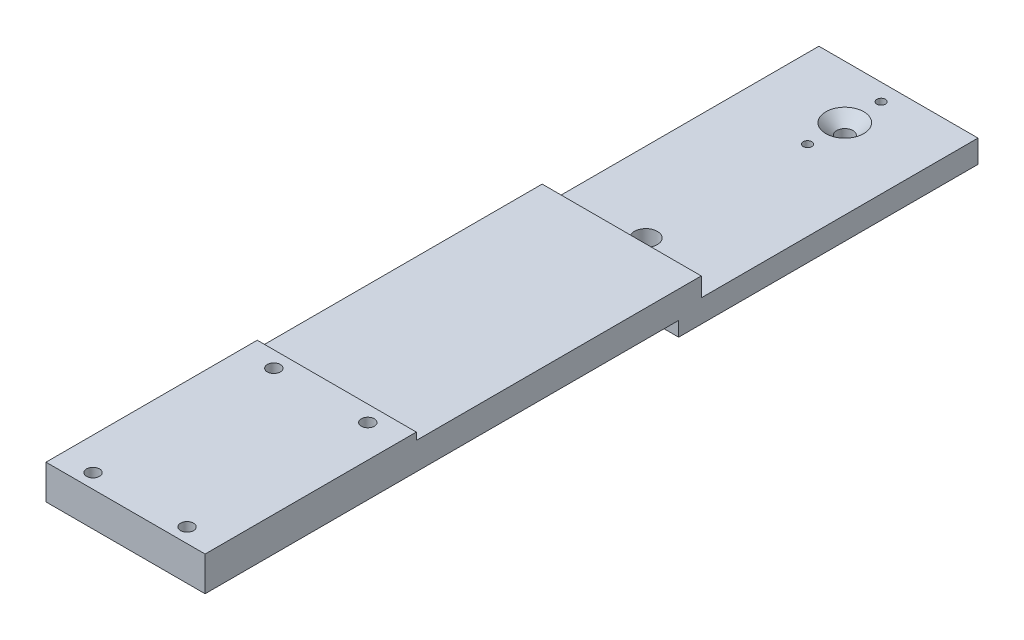
ISO-10303-21;
HEADER;
FILE_DESCRIPTION(('STEP AP214'),'2;1');
FILE_NAME('part.step','',(''),(''),'','','');
FILE_SCHEMA(('AUTOMOTIVE_DESIGN { 1 0 10303 214 1 1 1 1 }'));
ENDSEC;
DATA;
#1=APPLICATION_CONTEXT('core data for automotive mechanical design processes');
#2=APPLICATION_PROTOCOL_DEFINITION('international standard','automotive_design',2000,#1);
#3=PRODUCT_CONTEXT('',#1,'mechanical');
#4=PRODUCT('Part','Part','',(#3));
#5=PRODUCT_RELATED_PRODUCT_CATEGORY('part','',(#4));
#6=PRODUCT_DEFINITION_FORMATION('','',#4);
#7=PRODUCT_DEFINITION_CONTEXT('part definition',#1,'design');
#8=PRODUCT_DEFINITION('design','',#6,#7);
#9=PRODUCT_DEFINITION_SHAPE('','',#8);
#10=(LENGTH_UNIT() NAMED_UNIT(*) SI_UNIT(.MILLI.,.METRE.));
#11=(NAMED_UNIT(*) PLANE_ANGLE_UNIT() SI_UNIT($,.RADIAN.));
#12=(NAMED_UNIT(*) SI_UNIT($,.STERADIAN.) SOLID_ANGLE_UNIT());
#13=UNCERTAINTY_MEASURE_WITH_UNIT(LENGTH_MEASURE(1.E-05),#10,'distance_accuracy_value','');
#14=(GEOMETRIC_REPRESENTATION_CONTEXT(3) GLOBAL_UNCERTAINTY_ASSIGNED_CONTEXT((#13)) GLOBAL_UNIT_ASSIGNED_CONTEXT((#10,
#11,#12)) REPRESENTATION_CONTEXT('',''));
#15=CARTESIAN_POINT('',(0.,0.,0.));
#16=DIRECTION('',(0.,0.,1.));
#17=DIRECTION('',(1.,0.,0.));
#18=AXIS2_PLACEMENT_3D('',#15,#16,#17);
#19=CARTESIAN_POINT('',(-22.,0.,81.473999993));
#20=DIRECTION('',(0.,1.,0.));
#21=DIRECTION('',(0.,0.,1.));
#22=AXIS2_PLACEMENT_3D('',#19,#20,#21);
#23=PLANE('',#22);
#24=CARTESIAN_POINT('',(-13.,0.,77.473999993));
#25=DIRECTION('',(0.,-1.,0.));
#26=DIRECTION('',(0.,0.,-1.));
#27=AXIS2_PLACEMENT_3D('',#24,#25,#26);
#28=CIRCLE('',#27,3.35);
#29=CARTESIAN_POINT('',(-13.,0.,74.123999993));
#30=VERTEX_POINT('',#29);
#31=EDGE_CURVE('E179',#30,#30,#28,.T.);
#32=ORIENTED_EDGE('',*,*,#31,.F.);
#33=EDGE_LOOP('',(#32));
#34=FACE_BOUND('',#33,.T.);
#35=CARTESIAN_POINT('',(13.,0.,77.473999993));
#36=DIRECTION('',(0.,-1.,0.));
#37=DIRECTION('',(0.,0.,-1.));
#38=AXIS2_PLACEMENT_3D('',#35,#36,#37);
#39=CIRCLE('',#38,3.35);
#40=CARTESIAN_POINT('',(13.,0.,74.123999993));
#41=VERTEX_POINT('',#40);
#42=EDGE_CURVE('E440',#41,#41,#39,.T.);
#43=ORIENTED_EDGE('',*,*,#42,.F.);
#44=EDGE_LOOP('',(#43));
#45=FACE_BOUND('',#44,.T.);
#46=DIRECTION('',(-1.,0.,0.));
#47=VECTOR('',#46,1.);
#48=CARTESIAN_POINT('',(-22.,0.,-49.4877369000548));
#49=LINE('',#48,#47);
#50=CARTESIAN_POINT('',(22.,0.,-49.4877369000548));
#51=VERTEX_POINT('',#50);
#52=CARTESIAN_POINT('',(-22.,0.,-49.4877369000548));
#53=VERTEX_POINT('',#52);
#54=EDGE_CURVE('E48',#51,#53,#49,.T.);
#55=ORIENTED_EDGE('',*,*,#54,.F.);
#56=DIRECTION('',(0.,0.,-1.));
#57=VECTOR('',#56,1.);
#58=CARTESIAN_POINT('',(22.,0.,-81.473999993));
#59=LINE('',#58,#57);
#60=CARTESIAN_POINT('',(22.,0.,81.473999993));
#61=VERTEX_POINT('',#60);
#62=EDGE_CURVE('E163',#61,#51,#59,.T.);
#63=ORIENTED_EDGE('',*,*,#62,.F.);
#64=DIRECTION('',(1.,0.,0.));
#65=VECTOR('',#64,1.);
#66=CARTESIAN_POINT('',(-22.,0.,81.473999993));
#67=LINE('',#66,#65);
#68=CARTESIAN_POINT('',(-22.,0.,81.473999993));
#69=VERTEX_POINT('',#68);
#70=EDGE_CURVE('E199',#69,#61,#67,.T.);
#71=ORIENTED_EDGE('',*,*,#70,.F.);
#72=DIRECTION('',(0.,0.,1.));
#73=VECTOR('',#72,1.);
#74=CARTESIAN_POINT('',(-22.,0.,-81.473999993));
#75=LINE('',#74,#73);
#76=EDGE_CURVE('E197',#53,#69,#75,.T.);
#77=ORIENTED_EDGE('',*,*,#76,.F.);
#78=EDGE_LOOP('',(#55,#63,#71,#77));
#79=FACE_BOUND('',#78,.T.);
#80=CARTESIAN_POINT('',(-13.,0.,27.473999993));
#81=DIRECTION('',(0.,-1.,0.));
#82=DIRECTION('',(0.,0.,-1.));
#83=AXIS2_PLACEMENT_3D('',#80,#81,#82);
#84=CIRCLE('',#83,3.35);
#85=CARTESIAN_POINT('',(-13.,0.,24.123999993));
#86=VERTEX_POINT('',#85);
#87=EDGE_CURVE('E464',#86,#86,#84,.T.);
#88=ORIENTED_EDGE('',*,*,#87,.F.);
#89=EDGE_LOOP('',(#88));
#90=FACE_BOUND('',#89,.T.);
#91=CARTESIAN_POINT('',(13.,0.,27.473999993));
#92=DIRECTION('',(0.,-1.,0.));
#93=DIRECTION('',(0.,0.,-1.));
#94=AXIS2_PLACEMENT_3D('',#91,#92,#93);
#95=CIRCLE('',#94,3.35);
#96=CARTESIAN_POINT('',(13.,0.,24.123999993));
#97=VERTEX_POINT('',#96);
#98=EDGE_CURVE('E452',#97,#97,#95,.T.);
#99=ORIENTED_EDGE('',*,*,#98,.F.);
#100=EDGE_LOOP('',(#99));
#101=FACE_BOUND('',#100,.T.);
#102=ADVANCED_FACE('F33',(#34,#45,#79,#90,#101),#23,.F.);
#103=CARTESIAN_POINT('',(-22.,9.525,-81.473999993));
#104=DIRECTION('',(1.,0.,0.));
#105=DIRECTION('',(0.,0.,-1.));
#106=AXIS2_PLACEMENT_3D('',#103,#104,#105);
#107=PLANE('',#106);
#108=DIRECTION('',(0.,0.,1.));
#109=VECTOR('',#108,1.);
#110=CARTESIAN_POINT('',(-22.,7.525,-81.473999993));
#111=LINE('',#110,#109);
#112=CARTESIAN_POINT('',(-22.,7.525,-55.7388053269534));
#113=VERTEX_POINT('',#112);
#114=CARTESIAN_POINT('',(-22.,7.525,23.053999993));
#115=VERTEX_POINT('',#114);
#116=EDGE_CURVE('E224',#113,#115,#111,.T.);
#117=ORIENTED_EDGE('',*,*,#116,.F.);
#118=DIRECTION('',(0.,1.,0.));
#119=VECTOR('',#118,1.);
#120=CARTESIAN_POINT('',(-22.,2.275,-55.7388053269534));
#121=LINE('',#120,#119);
#122=CARTESIAN_POINT('',(-22.,2.275,-55.7388053269534));
#123=VERTEX_POINT('',#122);
#124=EDGE_CURVE('E56',#123,#113,#121,.T.);
#125=ORIENTED_EDGE('',*,*,#124,.F.);
#126=DIRECTION('',(0.,0.,1.));
#127=VECTOR('',#126,1.);
#128=CARTESIAN_POINT('',(-22.,2.275,-81.473999993));
#129=LINE('',#128,#127);
#130=CARTESIAN_POINT('',(-22.,2.275,-132.273999993));
#131=VERTEX_POINT('',#130);
#132=EDGE_CURVE('E111',#131,#123,#129,.T.);
#133=ORIENTED_EDGE('',*,*,#132,.F.);
#134=DIRECTION('',(0.,1.,0.));
#135=VECTOR('',#134,1.);
#136=CARTESIAN_POINT('',(-22.,2.275,-132.273999993));
#137=LINE('',#136,#135);
#138=CARTESIAN_POINT('',(-22.,-4.032,-132.273999993));
#139=VERTEX_POINT('',#138);
#140=EDGE_CURVE('E117',#139,#131,#137,.T.);
#141=ORIENTED_EDGE('',*,*,#140,.F.);
#142=DIRECTION('',(0.,0.,-1.));
#143=VECTOR('',#142,1.);
#144=CARTESIAN_POINT('',(-22.,-4.032,-81.473999993));
#145=LINE('',#144,#143);
#146=CARTESIAN_POINT('',(-22.,-4.032,-49.4877369000548));
#147=VERTEX_POINT('',#146);
#148=EDGE_CURVE('E151',#147,#139,#145,.T.);
#149=ORIENTED_EDGE('',*,*,#148,.F.);
#150=DIRECTION('',(0.,1.,0.));
#151=VECTOR('',#150,1.);
#152=CARTESIAN_POINT('',(-22.,-4.032,-49.4877369000548));
#153=LINE('',#152,#151);
#154=EDGE_CURVE('E157',#147,#53,#153,.T.);
#155=ORIENTED_EDGE('',*,*,#154,.T.);
#156=ORIENTED_EDGE('',*,*,#76,.T.);
#157=DIRECTION('',(0.,-1.,0.));
#158=VECTOR('',#157,1.);
#159=CARTESIAN_POINT('',(-22.,9.525,81.473999993));
#160=LINE('',#159,#158);
#161=CARTESIAN_POINT('',(-22.,9.525,81.473999993));
#162=VERTEX_POINT('',#161);
#163=EDGE_CURVE('E185',#162,#69,#160,.T.);
#164=ORIENTED_EDGE('',*,*,#163,.F.);
#165=DIRECTION('',(0.,0.,1.));
#166=VECTOR('',#165,1.);
#167=CARTESIAN_POINT('',(-22.,9.525,-81.473999993));
#168=LINE('',#167,#166);
#169=CARTESIAN_POINT('',(-22.,9.525,23.053999993));
#170=VERTEX_POINT('',#169);
#171=EDGE_CURVE('E208',#170,#162,#168,.T.);
#172=ORIENTED_EDGE('',*,*,#171,.F.);
#173=DIRECTION('',(0.,1.,0.));
#174=VECTOR('',#173,1.);
#175=CARTESIAN_POINT('',(-22.,7.525,23.053999993));
#176=LINE('',#175,#174);
#177=EDGE_CURVE('E217',#115,#170,#176,.T.);
#178=ORIENTED_EDGE('',*,*,#177,.F.);
#179=EDGE_LOOP('',(#117,#125,#133,#141,#149,#155,#156,#164,#172,#178));
#180=FACE_BOUND('',#179,.T.);
#181=ADVANCED_FACE('F114',(#180),#107,.F.);
#182=CARTESIAN_POINT('',(-22.,9.525,81.473999993));
#183=DIRECTION('',(0.,0.,-1.));
#184=DIRECTION('',(-1.,0.,0.));
#185=AXIS2_PLACEMENT_3D('',#182,#183,#184);
#186=PLANE('',#185);
#187=ORIENTED_EDGE('',*,*,#70,.T.);
#188=DIRECTION('',(0.,-1.,0.));
#189=VECTOR('',#188,1.);
#190=CARTESIAN_POINT('',(22.,9.525,81.473999993));
#191=LINE('',#190,#189);
#192=CARTESIAN_POINT('',(22.,9.525,81.473999993));
#193=VERTEX_POINT('',#192);
#194=EDGE_CURVE('E189',#193,#61,#191,.T.);
#195=ORIENTED_EDGE('',*,*,#194,.F.);
#196=DIRECTION('',(1.,0.,0.));
#197=VECTOR('',#196,1.);
#198=CARTESIAN_POINT('',(-22.,9.525,81.473999993));
#199=LINE('',#198,#197);
#200=EDGE_CURVE('E211',#162,#193,#199,.T.);
#201=ORIENTED_EDGE('',*,*,#200,.F.);
#202=ORIENTED_EDGE('',*,*,#163,.T.);
#203=EDGE_LOOP('',(#187,#195,#201,#202));
#204=FACE_BOUND('',#203,.T.);
#205=ADVANCED_FACE('F262',(#204),#186,.F.);
#206=CARTESIAN_POINT('',(22.,9.525,-81.473999993));
#207=DIRECTION('',(-1.,0.,0.));
#208=DIRECTION('',(0.,0.,1.));
#209=AXIS2_PLACEMENT_3D('',#206,#207,#208);
#210=PLANE('',#209);
#211=DIRECTION('',(0.,0.,-1.));
#212=VECTOR('',#211,1.);
#213=CARTESIAN_POINT('',(22.,2.275,-81.473999993));
#214=LINE('',#213,#212);
#215=CARTESIAN_POINT('',(22.,2.275,-55.7388053269534));
#216=VERTEX_POINT('',#215);
#217=CARTESIAN_POINT('',(22.,2.275,-132.273999993));
#218=VERTEX_POINT('',#217);
#219=EDGE_CURVE('E121',#216,#218,#214,.T.);
#220=ORIENTED_EDGE('',*,*,#219,.F.);
#221=DIRECTION('',(0.,1.,0.));
#222=VECTOR('',#221,1.);
#223=CARTESIAN_POINT('',(22.,2.275,-55.7388053269534));
#224=LINE('',#223,#222);
#225=CARTESIAN_POINT('',(22.,7.525,-55.7388053269534));
#226=VERTEX_POINT('',#225);
#227=EDGE_CURVE('E225',#216,#226,#224,.T.);
#228=ORIENTED_EDGE('',*,*,#227,.T.);
#229=DIRECTION('',(0.,0.,-1.));
#230=VECTOR('',#229,1.);
#231=CARTESIAN_POINT('',(22.,7.525,-81.473999993));
#232=LINE('',#231,#230);
#233=CARTESIAN_POINT('',(22.,7.525,23.053999993));
#234=VERTEX_POINT('',#233);
#235=EDGE_CURVE('E219',#234,#226,#232,.T.);
#236=ORIENTED_EDGE('',*,*,#235,.F.);
#237=DIRECTION('',(0.,1.,0.));
#238=VECTOR('',#237,1.);
#239=CARTESIAN_POINT('',(22.,7.525,23.053999993));
#240=LINE('',#239,#238);
#241=CARTESIAN_POINT('',(22.,9.525,23.053999993));
#242=VERTEX_POINT('',#241);
#243=EDGE_CURVE('E200',#234,#242,#240,.T.);
#244=ORIENTED_EDGE('',*,*,#243,.T.);
#245=DIRECTION('',(0.,0.,-1.));
#246=VECTOR('',#245,1.);
#247=CARTESIAN_POINT('',(22.,9.525,-81.473999993));
#248=LINE('',#247,#246);
#249=EDGE_CURVE('E195',#193,#242,#248,.T.);
#250=ORIENTED_EDGE('',*,*,#249,.F.);
#251=ORIENTED_EDGE('',*,*,#194,.T.);
#252=ORIENTED_EDGE('',*,*,#62,.T.);
#253=DIRECTION('',(0.,1.,0.));
#254=VECTOR('',#253,1.);
#255=CARTESIAN_POINT('',(22.,-4.032,-49.4877369000548));
#256=LINE('',#255,#254);
#257=CARTESIAN_POINT('',(22.,-4.032,-49.4877369000548));
#258=VERTEX_POINT('',#257);
#259=EDGE_CURVE('E168',#258,#51,#256,.T.);
#260=ORIENTED_EDGE('',*,*,#259,.F.);
#261=DIRECTION('',(0.,0.,1.));
#262=VECTOR('',#261,1.);
#263=CARTESIAN_POINT('',(22.,-4.032,-81.473999993));
#264=LINE('',#263,#262);
#265=CARTESIAN_POINT('',(22.,-4.032,-132.273999993));
#266=VERTEX_POINT('',#265);
#267=EDGE_CURVE('E153',#266,#258,#264,.T.);
#268=ORIENTED_EDGE('',*,*,#267,.F.);
#269=DIRECTION('',(0.,-1.,0.));
#270=VECTOR('',#269,1.);
#271=CARTESIAN_POINT('',(22.,2.275,-132.273999993));
#272=LINE('',#271,#270);
#273=EDGE_CURVE('E130',#218,#266,#272,.T.);
#274=ORIENTED_EDGE('',*,*,#273,.F.);
#275=EDGE_LOOP('',(#220,#228,#236,#244,#250,#251,#252,#260,#268,#274));
#276=FACE_BOUND('',#275,.T.);
#277=ADVANCED_FACE('F236',(#276),#210,.F.);
#278=CARTESIAN_POINT('',(-22.,9.525,81.473999993));
#279=DIRECTION('',(0.,1.,0.));
#280=DIRECTION('',(0.,0.,1.));
#281=AXIS2_PLACEMENT_3D('',#278,#279,#280);
#282=PLANE('',#281);
#283=CARTESIAN_POINT('',(-13.,9.525,77.473999993));
#284=DIRECTION('',(0.,-1.,0.));
#285=DIRECTION('',(0.,0.,-1.));
#286=AXIS2_PLACEMENT_3D('',#283,#284,#285);
#287=CIRCLE('',#286,1.8);
#288=CARTESIAN_POINT('',(-13.,9.525,75.6739999930001));
#289=VERTEX_POINT('',#288);
#290=EDGE_CURVE('E437',#289,#289,#287,.T.);
#291=ORIENTED_EDGE('',*,*,#290,.T.);
#292=EDGE_LOOP('',(#291));
#293=FACE_BOUND('',#292,.T.);
#294=CARTESIAN_POINT('',(13.,9.525,77.473999993));
#295=DIRECTION('',(0.,-1.,0.));
#296=DIRECTION('',(0.,0.,-1.));
#297=AXIS2_PLACEMENT_3D('',#294,#295,#296);
#298=CIRCLE('',#297,1.8);
#299=CARTESIAN_POINT('',(13.,9.525,75.673999993));
#300=VERTEX_POINT('',#299);
#301=EDGE_CURVE('E449',#300,#300,#298,.T.);
#302=ORIENTED_EDGE('',*,*,#301,.T.);
#303=EDGE_LOOP('',(#302));
#304=FACE_BOUND('',#303,.T.);
#305=CARTESIAN_POINT('',(13.,9.525,27.473999993));
#306=DIRECTION('',(0.,-1.,0.));
#307=DIRECTION('',(0.,0.,-1.));
#308=AXIS2_PLACEMENT_3D('',#305,#306,#307);
#309=CIRCLE('',#308,1.8);
#310=CARTESIAN_POINT('',(13.,9.525,25.673999993));
#311=VERTEX_POINT('',#310);
#312=EDGE_CURVE('E461',#311,#311,#309,.T.);
#313=ORIENTED_EDGE('',*,*,#312,.T.);
#314=EDGE_LOOP('',(#313));
#315=FACE_BOUND('',#314,.T.);
#316=CARTESIAN_POINT('',(-13.,9.525,27.473999993));
#317=DIRECTION('',(0.,-1.,0.));
#318=DIRECTION('',(0.,0.,-1.));
#319=AXIS2_PLACEMENT_3D('',#316,#317,#318);
#320=CIRCLE('',#319,1.8);
#321=CARTESIAN_POINT('',(-13.,9.525,25.673999993));
#322=VERTEX_POINT('',#321);
#323=EDGE_CURVE('E136',#322,#322,#320,.T.);
#324=ORIENTED_EDGE('',*,*,#323,.T.);
#325=EDGE_LOOP('',(#324));
#326=FACE_BOUND('',#325,.T.);
#327=DIRECTION('',(1.,0.,0.));
#328=VECTOR('',#327,1.);
#329=CARTESIAN_POINT('',(-22.,9.525,23.053999993));
#330=LINE('',#329,#328);
#331=EDGE_CURVE('E222',#170,#242,#330,.T.);
#332=ORIENTED_EDGE('',*,*,#331,.F.);
#333=ORIENTED_EDGE('',*,*,#171,.T.);
#334=ORIENTED_EDGE('',*,*,#200,.T.);
#335=ORIENTED_EDGE('',*,*,#249,.T.);
#336=EDGE_LOOP('',(#332,#333,#334,#335));
#337=FACE_BOUND('',#336,.T.);
#338=ADVANCED_FACE('F267',(#293,#304,#315,#326,#337),#282,.T.);
#339=CARTESIAN_POINT('',(-22.,7.525,23.053999993));
#340=DIRECTION('',(0.,0.,1.));
#341=DIRECTION('',(1.,0.,0.));
#342=AXIS2_PLACEMENT_3D('',#339,#340,#341);
#343=PLANE('',#342);
#344=ORIENTED_EDGE('',*,*,#331,.T.);
#345=ORIENTED_EDGE('',*,*,#243,.F.);
#346=DIRECTION('',(1.,0.,0.));
#347=VECTOR('',#346,1.);
#348=CARTESIAN_POINT('',(-22.,7.525,23.053999993));
#349=LINE('',#348,#347);
#350=EDGE_CURVE('E228',#115,#234,#349,.T.);
#351=ORIENTED_EDGE('',*,*,#350,.F.);
#352=ORIENTED_EDGE('',*,*,#177,.T.);
#353=EDGE_LOOP('',(#344,#345,#351,#352));
#354=FACE_BOUND('',#353,.T.);
#355=ADVANCED_FACE('F288',(#354),#343,.F.);
#356=CARTESIAN_POINT('',(-22.,7.525,23.053999993));
#357=DIRECTION('',(0.,1.,0.));
#358=DIRECTION('',(0.,0.,1.));
#359=AXIS2_PLACEMENT_3D('',#356,#357,#358);
#360=PLANE('',#359);
#361=DIRECTION('',(1.,0.,0.));
#362=VECTOR('',#361,1.);
#363=CARTESIAN_POINT('',(22.,7.525,-55.7388053269534));
#364=LINE('',#363,#362);
#365=EDGE_CURVE('E173',#113,#226,#364,.T.);
#366=ORIENTED_EDGE('',*,*,#365,.F.);
#367=ORIENTED_EDGE('',*,*,#116,.T.);
#368=ORIENTED_EDGE('',*,*,#350,.T.);
#369=ORIENTED_EDGE('',*,*,#235,.T.);
#370=EDGE_LOOP('',(#366,#367,#368,#369));
#371=FACE_BOUND('',#370,.T.);
#372=ADVANCED_FACE('F295',(#371),#360,.T.);
#373=CARTESIAN_POINT('',(22.,2.275,-55.7388053269534));
#374=DIRECTION('',(0.,0.,1.));
#375=DIRECTION('',(1.,0.,0.));
#376=AXIS2_PLACEMENT_3D('',#373,#374,#375);
#377=PLANE('',#376);
#378=ORIENTED_EDGE('',*,*,#365,.T.);
#379=ORIENTED_EDGE('',*,*,#227,.F.);
#380=DIRECTION('',(1.,0.,0.));
#381=VECTOR('',#380,1.);
#382=CARTESIAN_POINT('',(22.,2.275,-55.7388053269534));
#383=LINE('',#382,#381);
#384=EDGE_CURVE('E120',#123,#216,#383,.T.);
#385=ORIENTED_EDGE('',*,*,#384,.F.);
#386=ORIENTED_EDGE('',*,*,#124,.T.);
#387=EDGE_LOOP('',(#378,#379,#385,#386));
#388=FACE_BOUND('',#387,.T.);
#389=ADVANCED_FACE('F253',(#388),#377,.F.);
#390=CARTESIAN_POINT('',(22.,2.275,-55.7388053269534));
#391=DIRECTION('',(0.,-1.,0.));
#392=DIRECTION('',(0.,0.,-1.));
#393=AXIS2_PLACEMENT_3D('',#390,#391,#392);
#394=PLANE('',#393);
#395=CARTESIAN_POINT('',(-0.100070519600967,2.275,-117.540271761604));
#396=DIRECTION('',(0.,-1.,0.));
#397=DIRECTION('',(0.,0.,-1.));
#398=AXIS2_PLACEMENT_3D('',#395,#396,#397);
#399=CIRCLE('',#398,5.24999999999995);
#400=CARTESIAN_POINT('',(-0.100070519600967,2.275,-122.790271761604));
#401=VERTEX_POINT('',#400);
#402=EDGE_CURVE('E11',#401,#401,#399,.T.);
#403=ORIENTED_EDGE('',*,*,#402,.T.);
#404=EDGE_LOOP('',(#403));
#405=FACE_BOUND('',#404,.T.);
#406=CARTESIAN_POINT('',(-0.100070519600975,2.275,-107.254998873011));
#407=DIRECTION('',(0.,1.,0.));
#408=DIRECTION('',(0.,0.,1.));
#409=AXIS2_PLACEMENT_3D('',#406,#407,#408);
#410=CIRCLE('',#409,1.190625);
#411=CARTESIAN_POINT('',(-0.100070519600975,2.275,-106.064373873011));
#412=VERTEX_POINT('',#411);
#413=EDGE_CURVE('E183',#412,#412,#410,.T.);
#414=ORIENTED_EDGE('',*,*,#413,.F.);
#415=EDGE_LOOP('',(#414));
#416=FACE_BOUND('',#415,.T.);
#417=CARTESIAN_POINT('',(-0.100070519600968,2.275,-127.574998873011));
#418=DIRECTION('',(0.,1.,0.));
#419=DIRECTION('',(0.,0.,1.));
#420=AXIS2_PLACEMENT_3D('',#417,#418,#419);
#421=CIRCLE('',#420,1.19062500000001);
#422=CARTESIAN_POINT('',(-0.100070519600968,2.275,-126.384373873011));
#423=VERTEX_POINT('',#422);
#424=EDGE_CURVE('E180',#423,#423,#421,.T.);
#425=ORIENTED_EDGE('',*,*,#424,.F.);
#426=EDGE_LOOP('',(#425));
#427=FACE_BOUND('',#426,.T.);
#428=CARTESIAN_POINT('',(0.,2.275,-62.4240000070001));
#429=DIRECTION('',(0.,-1.,0.));
#430=DIRECTION('',(0.,0.,-1.));
#431=AXIS2_PLACEMENT_3D('',#428,#429,#430);
#432=CIRCLE('',#431,3.175);
#433=CARTESIAN_POINT('',(0.,2.275,-65.5990000070001));
#434=VERTEX_POINT('',#433);
#435=EDGE_CURVE('E148',#434,#434,#432,.T.);
#436=ORIENTED_EDGE('',*,*,#435,.T.);
#437=EDGE_LOOP('',(#436));
#438=FACE_BOUND('',#437,.T.);
#439=ORIENTED_EDGE('',*,*,#219,.T.);
#440=DIRECTION('',(1.,0.,0.));
#441=VECTOR('',#440,1.);
#442=CARTESIAN_POINT('',(-22.,2.275,-132.273999993));
#443=LINE('',#442,#441);
#444=EDGE_CURVE('E124',#131,#218,#443,.T.);
#445=ORIENTED_EDGE('',*,*,#444,.F.);
#446=ORIENTED_EDGE('',*,*,#132,.T.);
#447=ORIENTED_EDGE('',*,*,#384,.T.);
#448=EDGE_LOOP('',(#439,#445,#446,#447));
#449=FACE_BOUND('',#448,.T.);
#450=ADVANCED_FACE('F125',(#405,#416,#427,#438,#449),#394,.F.);
#451=CARTESIAN_POINT('',(-22.,-4.032,-49.4877369000548));
#452=DIRECTION('',(0.,0.,-1.));
#453=DIRECTION('',(-1.,0.,0.));
#454=AXIS2_PLACEMENT_3D('',#451,#452,#453);
#455=PLANE('',#454);
#456=ORIENTED_EDGE('',*,*,#54,.T.);
#457=ORIENTED_EDGE('',*,*,#154,.F.);
#458=DIRECTION('',(-1.,0.,0.));
#459=VECTOR('',#458,1.);
#460=CARTESIAN_POINT('',(-22.,-4.032,-49.4877369000548));
#461=LINE('',#460,#459);
#462=EDGE_CURVE('E155',#258,#147,#461,.T.);
#463=ORIENTED_EDGE('',*,*,#462,.F.);
#464=ORIENTED_EDGE('',*,*,#259,.T.);
#465=EDGE_LOOP('',(#456,#457,#463,#464));
#466=FACE_BOUND('',#465,.T.);
#467=ADVANCED_FACE('F243',(#466),#455,.F.);
#468=CARTESIAN_POINT('',(-22.,-4.032,-49.4877369000548));
#469=DIRECTION('',(0.,1.,0.));
#470=DIRECTION('',(0.,0.,1.));
#471=AXIS2_PLACEMENT_3D('',#468,#469,#470);
#472=PLANE('',#471);
#473=CARTESIAN_POINT('',(-0.100070519600967,-4.032,-117.540271761604));
#474=DIRECTION('',(0.,1.,0.));
#475=DIRECTION('',(0.,0.,1.));
#476=AXIS2_PLACEMENT_3D('',#473,#474,#475);
#477=CIRCLE('',#476,2.24999999999999);
#478=CARTESIAN_POINT('',(-0.100070519600967,-4.032,-115.290271761604));
#479=VERTEX_POINT('',#478);
#480=EDGE_CURVE('E423',#479,#479,#477,.T.);
#481=ORIENTED_EDGE('',*,*,#480,.T.);
#482=EDGE_LOOP('',(#481));
#483=FACE_BOUND('',#482,.T.);
#484=CARTESIAN_POINT('',(-0.100070519600975,-4.032,-107.254998873011));
#485=DIRECTION('',(0.,1.,0.));
#486=DIRECTION('',(0.,0.,1.));
#487=AXIS2_PLACEMENT_3D('',#484,#485,#486);
#488=CIRCLE('',#487,1.190625);
#489=CARTESIAN_POINT('',(-0.100070519600975,-4.032,-106.064373873011));
#490=VERTEX_POINT('',#489);
#491=EDGE_CURVE('E181',#490,#490,#488,.T.);
#492=ORIENTED_EDGE('',*,*,#491,.T.);
#493=EDGE_LOOP('',(#492));
#494=FACE_BOUND('',#493,.T.);
#495=CARTESIAN_POINT('',(-0.100070519600968,-4.032,-127.574998873011));
#496=DIRECTION('',(0.,1.,0.));
#497=DIRECTION('',(0.,0.,1.));
#498=AXIS2_PLACEMENT_3D('',#495,#496,#497);
#499=CIRCLE('',#498,1.19062500000001);
#500=CARTESIAN_POINT('',(-0.100070519600968,-4.032,-126.384373873011));
#501=VERTEX_POINT('',#500);
#502=EDGE_CURVE('E176',#501,#501,#499,.T.);
#503=ORIENTED_EDGE('',*,*,#502,.T.);
#504=EDGE_LOOP('',(#503));
#505=FACE_BOUND('',#504,.T.);
#506=CARTESIAN_POINT('',(0.,-4.032,-62.4240000070001));
#507=DIRECTION('',(0.,-1.,0.));
#508=DIRECTION('',(0.,0.,-1.));
#509=AXIS2_PLACEMENT_3D('',#506,#507,#508);
#510=CIRCLE('',#509,3.175);
#511=CARTESIAN_POINT('',(0.,-4.032,-65.5990000070001));
#512=VERTEX_POINT('',#511);
#513=EDGE_CURVE('E145',#512,#512,#510,.T.);
#514=ORIENTED_EDGE('',*,*,#513,.F.);
#515=EDGE_LOOP('',(#514));
#516=FACE_BOUND('',#515,.T.);
#517=ORIENTED_EDGE('',*,*,#148,.T.);
#518=DIRECTION('',(-1.,0.,0.));
#519=VECTOR('',#518,1.);
#520=CARTESIAN_POINT('',(-22.,-4.032,-132.273999993));
#521=LINE('',#520,#519);
#522=EDGE_CURVE('E135',#266,#139,#521,.T.);
#523=ORIENTED_EDGE('',*,*,#522,.F.);
#524=ORIENTED_EDGE('',*,*,#267,.T.);
#525=ORIENTED_EDGE('',*,*,#462,.T.);
#526=EDGE_LOOP('',(#517,#523,#524,#525));
#527=FACE_BOUND('',#526,.T.);
#528=ADVANCED_FACE('F239',(#483,#494,#505,#516,#527),#472,.F.);
#529=CARTESIAN_POINT('',(0.,-4.032,-62.4240000070001));
#530=DIRECTION('',(0.,-1.,0.));
#531=DIRECTION('',(0.,0.,-1.));
#532=AXIS2_PLACEMENT_3D('',#529,#530,#531);
#533=CYLINDRICAL_SURFACE('',#532,3.175);
#534=ORIENTED_EDGE('',*,*,#513,.T.);
#535=EDGE_LOOP('',(#534));
#536=FACE_BOUND('',#535,.T.);
#537=ORIENTED_EDGE('',*,*,#435,.F.);
#538=EDGE_LOOP('',(#537));
#539=FACE_BOUND('',#538,.T.);
#540=ADVANCED_FACE('F250',(#536,#539),#533,.F.);
#541=CARTESIAN_POINT('',(-22.,-4.032,-132.273999993));
#542=DIRECTION('',(0.,0.,1.));
#543=DIRECTION('',(1.,0.,0.));
#544=AXIS2_PLACEMENT_3D('',#541,#542,#543);
#545=PLANE('',#544);
#546=ORIENTED_EDGE('',*,*,#140,.T.);
#547=ORIENTED_EDGE('',*,*,#444,.T.);
#548=ORIENTED_EDGE('',*,*,#273,.T.);
#549=ORIENTED_EDGE('',*,*,#522,.T.);
#550=EDGE_LOOP('',(#546,#547,#548,#549));
#551=FACE_BOUND('',#550,.T.);
#552=ADVANCED_FACE('F133',(#551),#545,.F.);
#553=CARTESIAN_POINT('',(-13.,0.,27.473999993));
#554=DIRECTION('',(0.,-1.,0.));
#555=DIRECTION('',(0.,0.,-1.));
#556=AXIS2_PLACEMENT_3D('',#553,#554,#555);
#557=CYLINDRICAL_SURFACE('',#556,1.8);
#558=ORIENTED_EDGE('',*,*,#323,.F.);
#559=EDGE_LOOP('',(#558));
#560=FACE_BOUND('',#559,.T.);
#561=CARTESIAN_POINT('',(-13.,1.65,27.473999993));
#562=DIRECTION('',(0.,-1.,0.));
#563=DIRECTION('',(0.,0.,-1.));
#564=AXIS2_PLACEMENT_3D('',#561,#562,#563);
#565=CIRCLE('',#564,1.8);
#566=CARTESIAN_POINT('',(-13.,1.65,25.673999993));
#567=VERTEX_POINT('',#566);
#568=EDGE_CURVE('E139',#567,#567,#565,.T.);
#569=ORIENTED_EDGE('',*,*,#568,.T.);
#570=EDGE_LOOP('',(#569));
#571=FACE_BOUND('',#570,.T.);
#572=ADVANCED_FACE('F359',(#560,#571),#557,.F.);
#573=CARTESIAN_POINT('',(-11.2,1.65,27.473999993));
#574=DIRECTION('',(0.,1.,0.));
#575=DIRECTION('',(0.,0.,1.));
#576=AXIS2_PLACEMENT_3D('',#573,#574,#575);
#577=PLANE('',#576);
#578=ORIENTED_EDGE('',*,*,#568,.F.);
#579=EDGE_LOOP('',(#578));
#580=FACE_BOUND('',#579,.T.);
#581=CARTESIAN_POINT('',(-13.,1.65,27.473999993));
#582=DIRECTION('',(0.,-1.,0.));
#583=DIRECTION('',(0.,0.,-1.));
#584=AXIS2_PLACEMENT_3D('',#581,#582,#583);
#585=CIRCLE('',#584,3.35);
#586=CARTESIAN_POINT('',(-13.,1.65,24.123999993));
#587=VERTEX_POINT('',#586);
#588=EDGE_CURVE('E467',#587,#587,#585,.T.);
#589=ORIENTED_EDGE('',*,*,#588,.T.);
#590=EDGE_LOOP('',(#589));
#591=FACE_BOUND('',#590,.T.);
#592=ADVANCED_FACE('F364',(#580,#591),#577,.F.);
#593=CARTESIAN_POINT('',(-13.,0.,27.473999993));
#594=DIRECTION('',(0.,-1.,0.));
#595=DIRECTION('',(0.,0.,-1.));
#596=AXIS2_PLACEMENT_3D('',#593,#594,#595);
#597=CYLINDRICAL_SURFACE('',#596,3.35);
#598=ORIENTED_EDGE('',*,*,#588,.F.);
#599=EDGE_LOOP('',(#598));
#600=FACE_BOUND('',#599,.T.);
#601=ORIENTED_EDGE('',*,*,#87,.T.);
#602=EDGE_LOOP('',(#601));
#603=FACE_BOUND('',#602,.T.);
#604=ADVANCED_FACE('F368',(#600,#603),#597,.F.);
#605=CARTESIAN_POINT('',(13.,0.,27.473999993));
#606=DIRECTION('',(0.,-1.,0.));
#607=DIRECTION('',(0.,0.,-1.));
#608=AXIS2_PLACEMENT_3D('',#605,#606,#607);
#609=CYLINDRICAL_SURFACE('',#608,1.8);
#610=ORIENTED_EDGE('',*,*,#312,.F.);
#611=EDGE_LOOP('',(#610));
#612=FACE_BOUND('',#611,.T.);
#613=CARTESIAN_POINT('',(13.,1.65,27.473999993));
#614=DIRECTION('',(0.,-1.,0.));
#615=DIRECTION('',(0.,0.,-1.));
#616=AXIS2_PLACEMENT_3D('',#613,#614,#615);
#617=CIRCLE('',#616,1.8);
#618=CARTESIAN_POINT('',(13.,1.65,25.673999993));
#619=VERTEX_POINT('',#618);
#620=EDGE_CURVE('E458',#619,#619,#617,.T.);
#621=ORIENTED_EDGE('',*,*,#620,.T.);
#622=EDGE_LOOP('',(#621));
#623=FACE_BOUND('',#622,.T.);
#624=ADVANCED_FACE('F372',(#612,#623),#609,.F.);
#625=CARTESIAN_POINT('',(14.8,1.65,27.473999993));
#626=DIRECTION('',(0.,1.,0.));
#627=DIRECTION('',(0.,0.,1.));
#628=AXIS2_PLACEMENT_3D('',#625,#626,#627);
#629=PLANE('',#628);
#630=ORIENTED_EDGE('',*,*,#620,.F.);
#631=EDGE_LOOP('',(#630));
#632=FACE_BOUND('',#631,.T.);
#633=CARTESIAN_POINT('',(13.,1.65,27.473999993));
#634=DIRECTION('',(0.,-1.,0.));
#635=DIRECTION('',(0.,0.,-1.));
#636=AXIS2_PLACEMENT_3D('',#633,#634,#635);
#637=CIRCLE('',#636,3.35);
#638=CARTESIAN_POINT('',(13.,1.65,24.123999993));
#639=VERTEX_POINT('',#638);
#640=EDGE_CURVE('E455',#639,#639,#637,.T.);
#641=ORIENTED_EDGE('',*,*,#640,.T.);
#642=EDGE_LOOP('',(#641));
#643=FACE_BOUND('',#642,.T.);
#644=ADVANCED_FACE('F376',(#632,#643),#629,.F.);
#645=CARTESIAN_POINT('',(13.,0.,27.473999993));
#646=DIRECTION('',(0.,-1.,0.));
#647=DIRECTION('',(0.,0.,-1.));
#648=AXIS2_PLACEMENT_3D('',#645,#646,#647);
#649=CYLINDRICAL_SURFACE('',#648,3.35);
#650=ORIENTED_EDGE('',*,*,#640,.F.);
#651=EDGE_LOOP('',(#650));
#652=FACE_BOUND('',#651,.T.);
#653=ORIENTED_EDGE('',*,*,#98,.T.);
#654=EDGE_LOOP('',(#653));
#655=FACE_BOUND('',#654,.T.);
#656=ADVANCED_FACE('F380',(#652,#655),#649,.F.);
#657=CARTESIAN_POINT('',(13.,0.,77.473999993));
#658=DIRECTION('',(0.,-1.,0.));
#659=DIRECTION('',(0.,0.,-1.));
#660=AXIS2_PLACEMENT_3D('',#657,#658,#659);
#661=CYLINDRICAL_SURFACE('',#660,1.8);
#662=ORIENTED_EDGE('',*,*,#301,.F.);
#663=EDGE_LOOP('',(#662));
#664=FACE_BOUND('',#663,.T.);
#665=CARTESIAN_POINT('',(13.,1.65,77.473999993));
#666=DIRECTION('',(0.,-1.,0.));
#667=DIRECTION('',(0.,0.,-1.));
#668=AXIS2_PLACEMENT_3D('',#665,#666,#667);
#669=CIRCLE('',#668,1.8);
#670=CARTESIAN_POINT('',(13.,1.65,75.673999993));
#671=VERTEX_POINT('',#670);
#672=EDGE_CURVE('E446',#671,#671,#669,.T.);
#673=ORIENTED_EDGE('',*,*,#672,.T.);
#674=EDGE_LOOP('',(#673));
#675=FACE_BOUND('',#674,.T.);
#676=ADVANCED_FACE('F384',(#664,#675),#661,.F.);
#677=CARTESIAN_POINT('',(14.8,1.65,77.473999993));
#678=DIRECTION('',(0.,1.,0.));
#679=DIRECTION('',(0.,0.,1.));
#680=AXIS2_PLACEMENT_3D('',#677,#678,#679);
#681=PLANE('',#680);
#682=ORIENTED_EDGE('',*,*,#672,.F.);
#683=EDGE_LOOP('',(#682));
#684=FACE_BOUND('',#683,.T.);
#685=CARTESIAN_POINT('',(13.,1.65,77.473999993));
#686=DIRECTION('',(0.,-1.,0.));
#687=DIRECTION('',(0.,0.,-1.));
#688=AXIS2_PLACEMENT_3D('',#685,#686,#687);
#689=CIRCLE('',#688,3.35);
#690=CARTESIAN_POINT('',(13.,1.65,74.123999993));
#691=VERTEX_POINT('',#690);
#692=EDGE_CURVE('E443',#691,#691,#689,.T.);
#693=ORIENTED_EDGE('',*,*,#692,.T.);
#694=EDGE_LOOP('',(#693));
#695=FACE_BOUND('',#694,.T.);
#696=ADVANCED_FACE('F388',(#684,#695),#681,.F.);
#697=CARTESIAN_POINT('',(13.,0.,77.473999993));
#698=DIRECTION('',(0.,-1.,0.));
#699=DIRECTION('',(0.,0.,-1.));
#700=AXIS2_PLACEMENT_3D('',#697,#698,#699);
#701=CYLINDRICAL_SURFACE('',#700,3.35);
#702=ORIENTED_EDGE('',*,*,#692,.F.);
#703=EDGE_LOOP('',(#702));
#704=FACE_BOUND('',#703,.T.);
#705=ORIENTED_EDGE('',*,*,#42,.T.);
#706=EDGE_LOOP('',(#705));
#707=FACE_BOUND('',#706,.T.);
#708=ADVANCED_FACE('F392',(#704,#707),#701,.F.);
#709=CARTESIAN_POINT('',(-13.,0.,77.473999993));
#710=DIRECTION('',(0.,-1.,0.));
#711=DIRECTION('',(0.,0.,-1.));
#712=AXIS2_PLACEMENT_3D('',#709,#710,#711);
#713=CYLINDRICAL_SURFACE('',#712,1.8);
#714=ORIENTED_EDGE('',*,*,#290,.F.);
#715=EDGE_LOOP('',(#714));
#716=FACE_BOUND('',#715,.T.);
#717=CARTESIAN_POINT('',(-13.,1.65,77.473999993));
#718=DIRECTION('',(0.,-1.,0.));
#719=DIRECTION('',(0.,0.,-1.));
#720=AXIS2_PLACEMENT_3D('',#717,#718,#719);
#721=CIRCLE('',#720,1.8);
#722=CARTESIAN_POINT('',(-13.,1.65,75.6739999930001));
#723=VERTEX_POINT('',#722);
#724=EDGE_CURVE('E434',#723,#723,#721,.T.);
#725=ORIENTED_EDGE('',*,*,#724,.T.);
#726=EDGE_LOOP('',(#725));
#727=FACE_BOUND('',#726,.T.);
#728=ADVANCED_FACE('F396',(#716,#727),#713,.F.);
#729=CARTESIAN_POINT('',(-11.2,1.65,77.473999993));
#730=DIRECTION('',(0.,1.,0.));
#731=DIRECTION('',(0.,0.,1.));
#732=AXIS2_PLACEMENT_3D('',#729,#730,#731);
#733=PLANE('',#732);
#734=ORIENTED_EDGE('',*,*,#724,.F.);
#735=EDGE_LOOP('',(#734));
#736=FACE_BOUND('',#735,.T.);
#737=CARTESIAN_POINT('',(-13.,1.65,77.473999993));
#738=DIRECTION('',(0.,-1.,0.));
#739=DIRECTION('',(0.,0.,-1.));
#740=AXIS2_PLACEMENT_3D('',#737,#738,#739);
#741=CIRCLE('',#740,3.35);
#742=CARTESIAN_POINT('',(-13.,1.65,74.123999993));
#743=VERTEX_POINT('',#742);
#744=EDGE_CURVE('E431',#743,#743,#741,.T.);
#745=ORIENTED_EDGE('',*,*,#744,.T.);
#746=EDGE_LOOP('',(#745));
#747=FACE_BOUND('',#746,.T.);
#748=ADVANCED_FACE('F400',(#736,#747),#733,.F.);
#749=CARTESIAN_POINT('',(-13.,0.,77.473999993));
#750=DIRECTION('',(0.,-1.,0.));
#751=DIRECTION('',(0.,0.,-1.));
#752=AXIS2_PLACEMENT_3D('',#749,#750,#751);
#753=CYLINDRICAL_SURFACE('',#752,3.35);
#754=ORIENTED_EDGE('',*,*,#744,.F.);
#755=EDGE_LOOP('',(#754));
#756=FACE_BOUND('',#755,.T.);
#757=ORIENTED_EDGE('',*,*,#31,.T.);
#758=EDGE_LOOP('',(#757));
#759=FACE_BOUND('',#758,.T.);
#760=ADVANCED_FACE('F404',(#756,#759),#753,.F.);
#761=CARTESIAN_POINT('',(-0.100070519600968,-4.032025,-127.574998873011));
#762=DIRECTION('',(0.,1.,0.));
#763=DIRECTION('',(0.,0.,1.));
#764=AXIS2_PLACEMENT_3D('',#761,#762,#763);
#765=CYLINDRICAL_SURFACE('',#764,1.19062500000001);
#766=ORIENTED_EDGE('',*,*,#424,.T.);
#767=EDGE_LOOP('',(#766));
#768=FACE_BOUND('',#767,.T.);
#769=ORIENTED_EDGE('',*,*,#502,.F.);
#770=EDGE_LOOP('',(#769));
#771=FACE_BOUND('',#770,.T.);
#772=ADVANCED_FACE('F408',(#768,#771),#765,.F.);
#773=CARTESIAN_POINT('',(-0.100070519600975,-4.032025,-107.254998873011));
#774=DIRECTION('',(0.,1.,0.));
#775=DIRECTION('',(0.,0.,1.));
#776=AXIS2_PLACEMENT_3D('',#773,#774,#775);
#777=CYLINDRICAL_SURFACE('',#776,1.190625);
#778=ORIENTED_EDGE('',*,*,#413,.T.);
#779=EDGE_LOOP('',(#778));
#780=FACE_BOUND('',#779,.T.);
#781=ORIENTED_EDGE('',*,*,#491,.F.);
#782=EDGE_LOOP('',(#781));
#783=FACE_BOUND('',#782,.T.);
#784=ADVANCED_FACE('F328',(#780,#783),#777,.F.);
#785=CARTESIAN_POINT('',(-0.100070519600967,2.275,-117.540271761604));
#786=DIRECTION('',(0.,1.,0.));
#787=DIRECTION('',(0.,0.,1.));
#788=AXIS2_PLACEMENT_3D('',#785,#786,#787);
#789=CYLINDRICAL_SURFACE('',#788,2.24999999999999);
#790=CARTESIAN_POINT('',(-0.100070519600967,-0.724999999999935,-117.540271761604));
#791=DIRECTION('',(0.,-1.,0.));
#792=DIRECTION('',(0.,0.,-1.));
#793=AXIS2_PLACEMENT_3D('',#790,#791,#792);
#794=CIRCLE('',#793,2.24999999999999);
#795=CARTESIAN_POINT('',(-0.100070519600967,-0.724999999999935,-119.790271761604));
#796=VERTEX_POINT('',#795);
#797=EDGE_CURVE('E41',#796,#796,#794,.F.);
#798=ORIENTED_EDGE('',*,*,#797,.T.);
#799=EDGE_LOOP('',(#798));
#800=FACE_BOUND('',#799,.T.);
#801=ORIENTED_EDGE('',*,*,#480,.F.);
#802=EDGE_LOOP('',(#801));
#803=FACE_BOUND('',#802,.T.);
#804=ADVANCED_FACE('F323',(#800,#803),#789,.F.);
#805=CARTESIAN_POINT('',(-0.100070519600967,-0.724999999999934,-117.540271761604));
#806=DIRECTION('',(0.,1.,0.));
#807=DIRECTION('',(0.,0.,1.));
#808=AXIS2_PLACEMENT_3D('',#805,#806,#807);
#809=CONICAL_SURFACE('',#808,2.24999999999999,0.785398163397452);
#810=ORIENTED_EDGE('',*,*,#402,.F.);
#811=EDGE_LOOP('',(#810));
#812=FACE_BOUND('',#811,.T.);
#813=ORIENTED_EDGE('',*,*,#797,.F.);
#814=EDGE_LOOP('',(#813));
#815=FACE_BOUND('',#814,.T.);
#816=ADVANCED_FACE('F35',(#812,#815),#809,.F.);
#817=CLOSED_SHELL('',(#102,#181,#205,#277,#338,#355,#372,#389,#450,#467,#528,#540,#552,#572,
#592,#604,#624,#644,#656,#676,#696,#708,#728,#748,#760,#772,#784,#804,#816));
#818=MANIFOLD_SOLID_BREP('B2',#817);
#819=ADVANCED_BREP_SHAPE_REPRESENTATION('',(#18,#818),#14);
#820=SHAPE_DEFINITION_REPRESENTATION(#9,#819);
ENDSEC;
END-ISO-10303-21;
